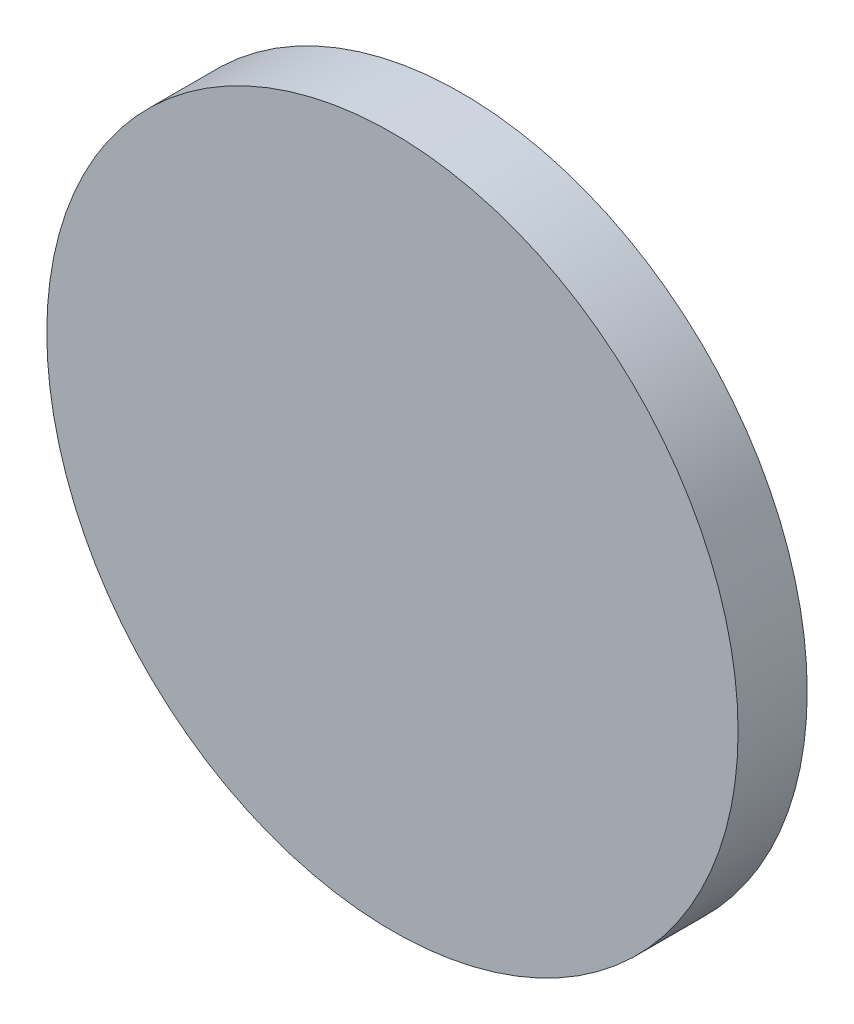
ISO-10303-21;
HEADER;
FILE_DESCRIPTION(('STEP AP214'),'2;1');
FILE_NAME('part.step','',(''),(''),'','','');
FILE_SCHEMA(('AUTOMOTIVE_DESIGN { 1 0 10303 214 1 1 1 1 }'));
ENDSEC;
DATA;
#1=APPLICATION_CONTEXT('core data for automotive mechanical design processes');
#2=APPLICATION_PROTOCOL_DEFINITION('international standard','automotive_design',2000,#1);
#3=PRODUCT_CONTEXT('',#1,'mechanical');
#4=PRODUCT('Part','Part','',(#3));
#5=PRODUCT_RELATED_PRODUCT_CATEGORY('part','',(#4));
#6=PRODUCT_DEFINITION_FORMATION('','',#4);
#7=PRODUCT_DEFINITION_CONTEXT('part definition',#1,'design');
#8=PRODUCT_DEFINITION('design','',#6,#7);
#9=PRODUCT_DEFINITION_SHAPE('','',#8);
#10=(LENGTH_UNIT() NAMED_UNIT(*) SI_UNIT(.MILLI.,.METRE.));
#11=(NAMED_UNIT(*) PLANE_ANGLE_UNIT() SI_UNIT($,.RADIAN.));
#12=(NAMED_UNIT(*) SI_UNIT($,.STERADIAN.) SOLID_ANGLE_UNIT());
#13=UNCERTAINTY_MEASURE_WITH_UNIT(LENGTH_MEASURE(1.E-05),#10,'distance_accuracy_value','');
#14=(GEOMETRIC_REPRESENTATION_CONTEXT(3) GLOBAL_UNCERTAINTY_ASSIGNED_CONTEXT((#13)) GLOBAL_UNIT_ASSIGNED_CONTEXT((#10,
#11,#12)) REPRESENTATION_CONTEXT('',''));
#15=CARTESIAN_POINT('',(0.,0.,0.));
#16=DIRECTION('',(0.,0.,1.));
#17=DIRECTION('',(1.,0.,0.));
#18=AXIS2_PLACEMENT_3D('',#15,#16,#17);
#19=CARTESIAN_POINT('',(0.,0.,16.));
#20=DIRECTION('',(0.,0.,-1.));
#21=DIRECTION('',(-1.,0.,0.));
#22=AXIS2_PLACEMENT_3D('',#19,#20,#21);
#23=CYLINDRICAL_SURFACE('',#22,80.);
#24=CARTESIAN_POINT('',(0.,0.,16.));
#25=DIRECTION('',(0.,0.,1.));
#26=DIRECTION('',(1.,0.,0.));
#27=AXIS2_PLACEMENT_3D('',#24,#25,#26);
#28=CIRCLE('',#27,80.);
#29=CARTESIAN_POINT('',(80.,0.,16.));
#30=VERTEX_POINT('',#29);
#31=EDGE_CURVE('E10',#30,#30,#28,.T.);
#32=ORIENTED_EDGE('',*,*,#31,.F.);
#33=EDGE_LOOP('',(#32));
#34=FACE_BOUND('',#33,.T.);
#35=CARTESIAN_POINT('',(0.,0.,0.));
#36=DIRECTION('',(0.,0.,1.));
#37=DIRECTION('',(1.,0.,0.));
#38=AXIS2_PLACEMENT_3D('',#35,#36,#37);
#39=CIRCLE('',#38,80.);
#40=CARTESIAN_POINT('',(80.,0.,0.));
#41=VERTEX_POINT('',#40);
#42=EDGE_CURVE('E40',#41,#41,#39,.T.);
#43=ORIENTED_EDGE('',*,*,#42,.T.);
#44=EDGE_LOOP('',(#43));
#45=FACE_BOUND('',#44,.T.);
#46=ADVANCED_FACE('F37',(#34,#45),#23,.T.);
#47=CARTESIAN_POINT('',(0.,0.,16.));
#48=DIRECTION('',(0.,0.,1.));
#49=DIRECTION('',(1.,0.,0.));
#50=AXIS2_PLACEMENT_3D('',#47,#48,#49);
#51=PLANE('',#50);
#52=ORIENTED_EDGE('',*,*,#31,.T.);
#53=EDGE_LOOP('',(#52));
#54=FACE_BOUND('',#53,.T.);
#55=ADVANCED_FACE('F52',(#54),#51,.T.);
#56=CARTESIAN_POINT('',(0.,0.,0.));
#57=DIRECTION('',(0.,0.,1.));
#58=DIRECTION('',(1.,0.,0.));
#59=AXIS2_PLACEMENT_3D('',#56,#57,#58);
#60=PLANE('',#59);
#61=ORIENTED_EDGE('',*,*,#42,.F.);
#62=EDGE_LOOP('',(#61));
#63=FACE_BOUND('',#62,.T.);
#64=ADVANCED_FACE('F50',(#63),#60,.F.);
#65=CLOSED_SHELL('',(#46,#55,#64));
#66=MANIFOLD_SOLID_BREP('B2',#65);
#67=ADVANCED_BREP_SHAPE_REPRESENTATION('',(#18,#66),#14);
#68=SHAPE_DEFINITION_REPRESENTATION(#9,#67);
ENDSEC;
END-ISO-10303-21;
